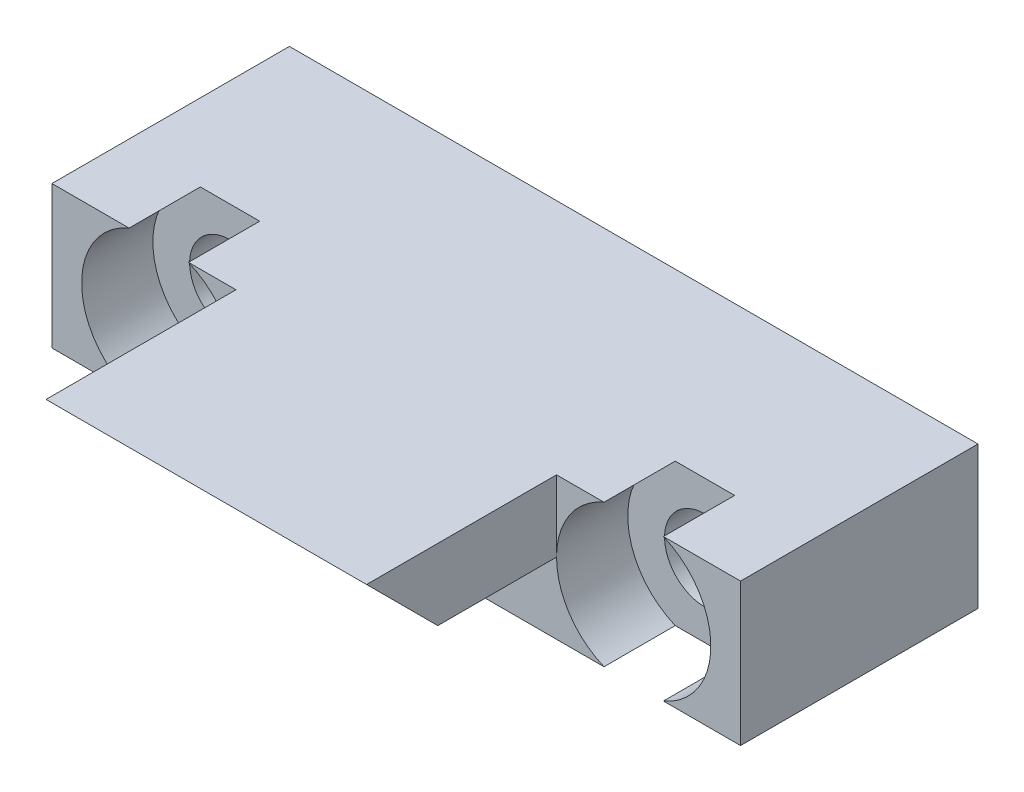
ISO-10303-21;
HEADER;
FILE_DESCRIPTION(('STEP AP214'),'2;1');
FILE_NAME('part.step','',(''),(''),'','','');
FILE_SCHEMA(('AUTOMOTIVE_DESIGN { 1 0 10303 214 1 1 1 1 }'));
ENDSEC;
DATA;
#1=APPLICATION_CONTEXT('core data for automotive mechanical design processes');
#2=APPLICATION_PROTOCOL_DEFINITION('international standard','automotive_design',2000,#1);
#3=PRODUCT_CONTEXT('',#1,'mechanical');
#4=PRODUCT('Part','Part','',(#3));
#5=PRODUCT_RELATED_PRODUCT_CATEGORY('part','',(#4));
#6=PRODUCT_DEFINITION_FORMATION('','',#4);
#7=PRODUCT_DEFINITION_CONTEXT('part definition',#1,'design');
#8=PRODUCT_DEFINITION('design','',#6,#7);
#9=PRODUCT_DEFINITION_SHAPE('','',#8);
#10=(LENGTH_UNIT() NAMED_UNIT(*) SI_UNIT(.MILLI.,.METRE.));
#11=(NAMED_UNIT(*) PLANE_ANGLE_UNIT() SI_UNIT($,.RADIAN.));
#12=(NAMED_UNIT(*) SI_UNIT($,.STERADIAN.) SOLID_ANGLE_UNIT());
#13=UNCERTAINTY_MEASURE_WITH_UNIT(LENGTH_MEASURE(1.E-05),#10,'distance_accuracy_value','');
#14=(GEOMETRIC_REPRESENTATION_CONTEXT(3) GLOBAL_UNCERTAINTY_ASSIGNED_CONTEXT((#13)) GLOBAL_UNIT_ASSIGNED_CONTEXT((#10,
#11,#12)) REPRESENTATION_CONTEXT('',''));
#15=CARTESIAN_POINT('',(0.,0.,0.));
#16=DIRECTION('',(0.,0.,1.));
#17=DIRECTION('',(1.,0.,0.));
#18=AXIS2_PLACEMENT_3D('',#15,#16,#17);
#19=CARTESIAN_POINT('',(0.,0.,10.));
#20=DIRECTION('',(0.,0.,-1.));
#21=DIRECTION('',(-1.,0.,0.));
#22=AXIS2_PLACEMENT_3D('',#19,#20,#21);
#23=PLANE('',#22);
#24=DIRECTION('',(-1.,0.,0.));
#25=VECTOR('',#24,1.);
#26=CARTESIAN_POINT('',(-14.5,3.,10.));
#27=LINE('',#26,#25);
#28=CARTESIAN_POINT('',(-6.75,3.,10.));
#29=VERTEX_POINT('',#28);
#30=CARTESIAN_POINT('',(-8.75,3.,10.));
#31=VERTEX_POINT('',#30);
#32=EDGE_CURVE('E244',#29,#31,#27,.T.);
#33=ORIENTED_EDGE('',*,*,#32,.T.);
#34=CARTESIAN_POINT('',(-10.,0.,10.));
#35=DIRECTION('',(0.,0.,1.));
#36=DIRECTION('',(1.,0.,0.));
#37=AXIS2_PLACEMENT_3D('',#34,#35,#36);
#38=CIRCLE('',#37,3.25);
#39=CARTESIAN_POINT('',(-6.75,0.,10.));
#40=VERTEX_POINT('',#39);
#41=EDGE_CURVE('E161',#40,#31,#38,.T.);
#42=ORIENTED_EDGE('',*,*,#41,.F.);
#43=DIRECTION('',(0.,-1.,0.));
#44=VECTOR('',#43,1.);
#45=CARTESIAN_POINT('',(-6.75,3.,10.));
#46=LINE('',#45,#44);
#47=EDGE_CURVE('E270',#29,#40,#46,.T.);
#48=ORIENTED_EDGE('',*,*,#47,.F.);
#49=EDGE_LOOP('',(#33,#42,#48));
#50=FACE_BOUND('',#49,.T.);
#51=ADVANCED_FACE('F41',(#50),#23,.F.);
#52=DIRECTION('',(1.,0.,0.));
#53=VECTOR('',#52,1.);
#54=CARTESIAN_POINT('',(-6.75,0.,10.));
#55=LINE('',#54,#53);
#56=CARTESIAN_POINT('',(6.75,0.,10.));
#57=VERTEX_POINT('',#56);
#58=EDGE_CURVE('E266',#40,#57,#55,.T.);
#59=ORIENTED_EDGE('',*,*,#58,.F.);
#60=CARTESIAN_POINT('',(-8.75,-3.,10.));
#61=VERTEX_POINT('',#60);
#62=EDGE_CURVE('E330',#61,#40,#38,.T.);
#63=ORIENTED_EDGE('',*,*,#62,.F.);
#64=DIRECTION('',(1.,0.,0.));
#65=VECTOR('',#64,1.);
#66=CARTESIAN_POINT('',(-14.5,-3.,10.));
#67=LINE('',#66,#65);
#68=CARTESIAN_POINT('',(8.75000000000001,-3.,10.));
#69=VERTEX_POINT('',#68);
#70=EDGE_CURVE('E233',#61,#69,#67,.T.);
#71=ORIENTED_EDGE('',*,*,#70,.T.);
#72=CARTESIAN_POINT('',(10.,0.,10.));
#73=DIRECTION('',(0.,0.,1.));
#74=DIRECTION('',(1.,0.,0.));
#75=AXIS2_PLACEMENT_3D('',#72,#73,#74);
#76=CIRCLE('',#75,3.25);
#77=EDGE_CURVE('E310',#57,#69,#76,.T.);
#78=ORIENTED_EDGE('',*,*,#77,.F.);
#79=EDGE_LOOP('',(#59,#63,#71,#78));
#80=FACE_BOUND('',#79,.T.);
#81=ADVANCED_FACE('F339',(#80),#23,.F.);
#82=CARTESIAN_POINT('',(14.5,3.,10.));
#83=VERTEX_POINT('',#82);
#84=CARTESIAN_POINT('',(11.25,3.,10.));
#85=VERTEX_POINT('',#84);
#86=EDGE_CURVE('E238',#83,#85,#27,.T.);
#87=ORIENTED_EDGE('',*,*,#86,.T.);
#88=CARTESIAN_POINT('',(11.25,-3.,10.));
#89=VERTEX_POINT('',#88);
#90=EDGE_CURVE('E307',#89,#85,#76,.T.);
#91=ORIENTED_EDGE('',*,*,#90,.F.);
#92=CARTESIAN_POINT('',(14.5,-3.,10.));
#93=VERTEX_POINT('',#92);
#94=EDGE_CURVE('E234',#89,#93,#67,.T.);
#95=ORIENTED_EDGE('',*,*,#94,.T.);
#96=DIRECTION('',(0.,1.,0.));
#97=VECTOR('',#96,1.);
#98=CARTESIAN_POINT('',(14.5,-3.,10.));
#99=LINE('',#98,#97);
#100=EDGE_CURVE('E218',#93,#83,#99,.T.);
#101=ORIENTED_EDGE('',*,*,#100,.T.);
#102=EDGE_LOOP('',(#87,#91,#95,#101));
#103=FACE_BOUND('',#102,.T.);
#104=ADVANCED_FACE('F387',(#103),#23,.F.);
#105=DIRECTION('',(0.,1.,0.));
#106=VECTOR('',#105,1.);
#107=CARTESIAN_POINT('',(6.75,3.,10.));
#108=LINE('',#107,#106);
#109=CARTESIAN_POINT('',(6.74999999999999,3.,10.));
#110=VERTEX_POINT('',#109);
#111=EDGE_CURVE('E262',#57,#110,#108,.T.);
#112=ORIENTED_EDGE('',*,*,#111,.F.);
#113=CARTESIAN_POINT('',(8.74999999999999,3.,10.));
#114=VERTEX_POINT('',#113);
#115=EDGE_CURVE('E306',#114,#57,#76,.T.);
#116=ORIENTED_EDGE('',*,*,#115,.F.);
#117=EDGE_CURVE('E242',#114,#110,#27,.T.);
#118=ORIENTED_EDGE('',*,*,#117,.T.);
#119=EDGE_LOOP('',(#112,#116,#118));
#120=FACE_BOUND('',#119,.T.);
#121=ADVANCED_FACE('F412',(#120),#23,.F.);
#122=CARTESIAN_POINT('',(-14.5,-3.,10.));
#123=VERTEX_POINT('',#122);
#124=CARTESIAN_POINT('',(-11.25,-3.,10.));
#125=VERTEX_POINT('',#124);
#126=EDGE_CURVE('E214',#123,#125,#67,.T.);
#127=ORIENTED_EDGE('',*,*,#126,.T.);
#128=CARTESIAN_POINT('',(-11.25,3.,10.));
#129=VERTEX_POINT('',#128);
#130=EDGE_CURVE('E329',#129,#125,#38,.T.);
#131=ORIENTED_EDGE('',*,*,#130,.F.);
#132=CARTESIAN_POINT('',(-14.5,3.,10.));
#133=VERTEX_POINT('',#132);
#134=EDGE_CURVE('E243',#129,#133,#27,.T.);
#135=ORIENTED_EDGE('',*,*,#134,.T.);
#136=DIRECTION('',(0.,-1.,0.));
#137=VECTOR('',#136,1.);
#138=CARTESIAN_POINT('',(-14.5,-3.,10.));
#139=LINE('',#138,#137);
#140=EDGE_CURVE('E235',#133,#123,#139,.T.);
#141=ORIENTED_EDGE('',*,*,#140,.T.);
#142=EDGE_LOOP('',(#127,#131,#135,#141));
#143=FACE_BOUND('',#142,.T.);
#144=ADVANCED_FACE('F358',(#143),#23,.F.);
#145=CARTESIAN_POINT('',(14.5,-3.,10.));
#146=DIRECTION('',(-1.,0.,0.));
#147=DIRECTION('',(0.,0.,1.));
#148=AXIS2_PLACEMENT_3D('',#145,#146,#147);
#149=PLANE('',#148);
#150=DIRECTION('',(0.,1.,0.));
#151=VECTOR('',#150,1.);
#152=CARTESIAN_POINT('',(14.5,-3.,0.));
#153=LINE('',#152,#151);
#154=CARTESIAN_POINT('',(14.5,-3.,0.));
#155=VERTEX_POINT('',#154);
#156=CARTESIAN_POINT('',(14.5,3.,0.));
#157=VERTEX_POINT('',#156);
#158=EDGE_CURVE('E225',#155,#157,#153,.T.);
#159=ORIENTED_EDGE('',*,*,#158,.T.);
#160=DIRECTION('',(0.,0.,-1.));
#161=VECTOR('',#160,1.);
#162=CARTESIAN_POINT('',(14.5,3.,10.));
#163=LINE('',#162,#161);
#164=EDGE_CURVE('E198',#83,#157,#163,.T.);
#165=ORIENTED_EDGE('',*,*,#164,.F.);
#166=ORIENTED_EDGE('',*,*,#100,.F.);
#167=DIRECTION('',(0.,0.,-1.));
#168=VECTOR('',#167,1.);
#169=CARTESIAN_POINT('',(14.5,-3.,10.));
#170=LINE('',#169,#168);
#171=EDGE_CURVE('E210',#93,#155,#170,.T.);
#172=ORIENTED_EDGE('',*,*,#171,.T.);
#173=EDGE_LOOP('',(#159,#165,#166,#172));
#174=FACE_BOUND('',#173,.T.);
#175=ADVANCED_FACE('F392',(#174),#149,.F.);
#176=CARTESIAN_POINT('',(-14.5,3.,10.));
#177=DIRECTION('',(0.,-1.,0.));
#178=DIRECTION('',(0.,0.,-1.));
#179=AXIS2_PLACEMENT_3D('',#176,#177,#178);
#180=PLANE('',#179);
#181=DIRECTION('',(1.,0.,0.));
#182=VECTOR('',#181,1.);
#183=CARTESIAN_POINT('',(-14.5,3.,7.));
#184=LINE('',#183,#182);
#185=CARTESIAN_POINT('',(-11.25,3.,7.));
#186=VERTEX_POINT('',#185);
#187=CARTESIAN_POINT('',(-8.75,3.,7.));
#188=VERTEX_POINT('',#187);
#189=EDGE_CURVE('E167',#186,#188,#184,.T.);
#190=ORIENTED_EDGE('',*,*,#189,.T.);
#191=DIRECTION('',(0.,0.,1.));
#192=VECTOR('',#191,1.);
#193=CARTESIAN_POINT('',(-8.75,3.,10.));
#194=LINE('',#193,#192);
#195=EDGE_CURVE('E154',#188,#31,#194,.T.);
#196=ORIENTED_EDGE('',*,*,#195,.T.);
#197=ORIENTED_EDGE('',*,*,#32,.F.);
#198=DIRECTION('',(0.,0.,-1.));
#199=VECTOR('',#198,1.);
#200=CARTESIAN_POINT('',(-6.75,3.,18.));
#201=LINE('',#200,#199);
#202=CARTESIAN_POINT('',(-6.75,3.,18.));
#203=VERTEX_POINT('',#202);
#204=EDGE_CURVE('E257',#203,#29,#201,.T.);
#205=ORIENTED_EDGE('',*,*,#204,.F.);
#206=DIRECTION('',(-1.,0.,0.));
#207=VECTOR('',#206,1.);
#208=CARTESIAN_POINT('',(-6.75,3.,18.));
#209=LINE('',#208,#207);
#210=CARTESIAN_POINT('',(6.75,3.,18.));
#211=VERTEX_POINT('',#210);
#212=EDGE_CURVE('E261',#211,#203,#209,.T.);
#213=ORIENTED_EDGE('',*,*,#212,.F.);
#214=DIRECTION('',(0.,0.,-1.));
#215=VECTOR('',#214,1.);
#216=CARTESIAN_POINT('',(6.75,3.,18.));
#217=LINE('',#216,#215);
#218=EDGE_CURVE('E253',#211,#110,#217,.T.);
#219=ORIENTED_EDGE('',*,*,#218,.T.);
#220=ORIENTED_EDGE('',*,*,#117,.F.);
#221=DIRECTION('',(0.,0.,1.));
#222=VECTOR('',#221,1.);
#223=CARTESIAN_POINT('',(8.74999999999999,3.,10.));
#224=LINE('',#223,#222);
#225=CARTESIAN_POINT('',(8.74999999999999,3.,7.));
#226=VERTEX_POINT('',#225);
#227=EDGE_CURVE('E289',#114,#226,#224,.F.);
#228=ORIENTED_EDGE('',*,*,#227,.T.);
#229=DIRECTION('',(1.,0.,0.));
#230=VECTOR('',#229,1.);
#231=CARTESIAN_POINT('',(-14.5,3.,7.));
#232=LINE('',#231,#230);
#233=CARTESIAN_POINT('',(11.25,3.,7.));
#234=VERTEX_POINT('',#233);
#235=EDGE_CURVE('E194',#226,#234,#232,.T.);
#236=ORIENTED_EDGE('',*,*,#235,.T.);
#237=DIRECTION('',(0.,0.,1.));
#238=VECTOR('',#237,1.);
#239=CARTESIAN_POINT('',(11.25,3.,10.));
#240=LINE('',#239,#238);
#241=EDGE_CURVE('E281',#234,#85,#240,.T.);
#242=ORIENTED_EDGE('',*,*,#241,.T.);
#243=ORIENTED_EDGE('',*,*,#86,.F.);
#244=ORIENTED_EDGE('',*,*,#164,.T.);
#245=DIRECTION('',(-1.,0.,0.));
#246=VECTOR('',#245,1.);
#247=CARTESIAN_POINT('',(-14.5,3.,0.));
#248=LINE('',#247,#246);
#249=CARTESIAN_POINT('',(-14.5,3.,0.));
#250=VERTEX_POINT('',#249);
#251=EDGE_CURVE('E222',#157,#250,#248,.T.);
#252=ORIENTED_EDGE('',*,*,#251,.T.);
#253=DIRECTION('',(0.,0.,-1.));
#254=VECTOR('',#253,1.);
#255=CARTESIAN_POINT('',(-14.5,3.,10.));
#256=LINE('',#255,#254);
#257=EDGE_CURVE('E202',#133,#250,#256,.T.);
#258=ORIENTED_EDGE('',*,*,#257,.F.);
#259=ORIENTED_EDGE('',*,*,#134,.F.);
#260=DIRECTION('',(0.,0.,1.));
#261=VECTOR('',#260,1.);
#262=CARTESIAN_POINT('',(-11.25,3.,10.));
#263=LINE('',#262,#261);
#264=EDGE_CURVE('E181',#129,#186,#263,.F.);
#265=ORIENTED_EDGE('',*,*,#264,.T.);
#266=EDGE_LOOP('',(#190,#196,#197,#205,#213,#219,#220,#228,#236,#242,#243,#244,#252,#258,#259,#265));
#267=FACE_BOUND('',#266,.T.);
#268=ADVANCED_FACE('F179',(#267),#180,.F.);
#269=CARTESIAN_POINT('',(-14.5,-3.,10.));
#270=DIRECTION('',(1.,0.,0.));
#271=DIRECTION('',(0.,0.,-1.));
#272=AXIS2_PLACEMENT_3D('',#269,#270,#271);
#273=PLANE('',#272);
#274=DIRECTION('',(0.,-1.,0.));
#275=VECTOR('',#274,1.);
#276=CARTESIAN_POINT('',(-14.5,-3.,0.));
#277=LINE('',#276,#275);
#278=CARTESIAN_POINT('',(-14.5,-3.,0.));
#279=VERTEX_POINT('',#278);
#280=EDGE_CURVE('E219',#250,#279,#277,.T.);
#281=ORIENTED_EDGE('',*,*,#280,.T.);
#282=DIRECTION('',(0.,0.,-1.));
#283=VECTOR('',#282,1.);
#284=CARTESIAN_POINT('',(-14.5,-3.,10.));
#285=LINE('',#284,#283);
#286=EDGE_CURVE('E206',#123,#279,#285,.T.);
#287=ORIENTED_EDGE('',*,*,#286,.F.);
#288=ORIENTED_EDGE('',*,*,#140,.F.);
#289=ORIENTED_EDGE('',*,*,#257,.T.);
#290=EDGE_LOOP('',(#281,#287,#288,#289));
#291=FACE_BOUND('',#290,.T.);
#292=ADVANCED_FACE('F363',(#291),#273,.F.);
#293=CARTESIAN_POINT('',(-14.5,-3.,10.));
#294=DIRECTION('',(0.,1.,0.));
#295=DIRECTION('',(0.,0.,1.));
#296=AXIS2_PLACEMENT_3D('',#293,#294,#295);
#297=PLANE('',#296);
#298=DIRECTION('',(-1.,0.,0.));
#299=VECTOR('',#298,1.);
#300=CARTESIAN_POINT('',(-14.5,-3.,7.));
#301=LINE('',#300,#299);
#302=CARTESIAN_POINT('',(-8.75,-3.,7.));
#303=VERTEX_POINT('',#302);
#304=CARTESIAN_POINT('',(-11.25,-3.,7.));
#305=VERTEX_POINT('',#304);
#306=EDGE_CURVE('E175',#303,#305,#301,.T.);
#307=ORIENTED_EDGE('',*,*,#306,.T.);
#308=DIRECTION('',(0.,0.,1.));
#309=VECTOR('',#308,1.);
#310=CARTESIAN_POINT('',(-11.25,-3.,10.));
#311=LINE('',#310,#309);
#312=EDGE_CURVE('E313',#305,#125,#311,.T.);
#313=ORIENTED_EDGE('',*,*,#312,.T.);
#314=ORIENTED_EDGE('',*,*,#126,.F.);
#315=ORIENTED_EDGE('',*,*,#286,.T.);
#316=DIRECTION('',(1.,0.,0.));
#317=VECTOR('',#316,1.);
#318=CARTESIAN_POINT('',(-14.5,-3.,0.));
#319=LINE('',#318,#317);
#320=EDGE_CURVE('E215',#279,#155,#319,.T.);
#321=ORIENTED_EDGE('',*,*,#320,.T.);
#322=ORIENTED_EDGE('',*,*,#171,.F.);
#323=ORIENTED_EDGE('',*,*,#94,.F.);
#324=DIRECTION('',(0.,0.,1.));
#325=VECTOR('',#324,1.);
#326=CARTESIAN_POINT('',(11.25,-3.,10.));
#327=LINE('',#326,#325);
#328=CARTESIAN_POINT('',(11.25,-3.,7.));
#329=VERTEX_POINT('',#328);
#330=EDGE_CURVE('E285',#89,#329,#327,.F.);
#331=ORIENTED_EDGE('',*,*,#330,.T.);
#332=DIRECTION('',(-1.,0.,0.));
#333=VECTOR('',#332,1.);
#334=CARTESIAN_POINT('',(-14.5,-3.,7.));
#335=LINE('',#334,#333);
#336=CARTESIAN_POINT('',(8.75000000000001,-3.,7.));
#337=VERTEX_POINT('',#336);
#338=EDGE_CURVE('E185',#329,#337,#335,.T.);
#339=ORIENTED_EDGE('',*,*,#338,.T.);
#340=DIRECTION('',(0.,0.,1.));
#341=VECTOR('',#340,1.);
#342=CARTESIAN_POINT('',(8.75000000000001,-3.,10.));
#343=LINE('',#342,#341);
#344=EDGE_CURVE('E274',#337,#69,#343,.T.);
#345=ORIENTED_EDGE('',*,*,#344,.T.);
#346=ORIENTED_EDGE('',*,*,#70,.F.);
#347=DIRECTION('',(0.,0.,1.));
#348=VECTOR('',#347,1.);
#349=CARTESIAN_POINT('',(-8.75,-3.,10.));
#350=LINE('',#349,#348);
#351=EDGE_CURVE('E317',#61,#303,#350,.F.);
#352=ORIENTED_EDGE('',*,*,#351,.T.);
#353=EDGE_LOOP('',(#307,#313,#314,#315,#321,#322,#323,#331,#339,#345,#346,#352));
#354=FACE_BOUND('',#353,.T.);
#355=ADVANCED_FACE('F367',(#354),#297,.F.);
#356=CARTESIAN_POINT('',(0.,0.,0.));
#357=DIRECTION('',(0.,0.,-1.));
#358=DIRECTION('',(-1.,0.,0.));
#359=AXIS2_PLACEMENT_3D('',#356,#357,#358);
#360=PLANE('',#359);
#361=CARTESIAN_POINT('',(-10.,0.,0.));
#362=DIRECTION('',(0.,0.,1.));
#363=DIRECTION('',(1.,0.,0.));
#364=AXIS2_PLACEMENT_3D('',#361,#362,#363);
#365=CIRCLE('',#364,1.7);
#366=CARTESIAN_POINT('',(-8.3,0.,0.));
#367=VERTEX_POINT('',#366);
#368=EDGE_CURVE('E320',#367,#367,#365,.T.);
#369=ORIENTED_EDGE('',*,*,#368,.T.);
#370=EDGE_LOOP('',(#369));
#371=FACE_BOUND('',#370,.T.);
#372=CARTESIAN_POINT('',(10.,0.,0.));
#373=DIRECTION('',(0.,0.,1.));
#374=DIRECTION('',(1.,0.,0.));
#375=AXIS2_PLACEMENT_3D('',#372,#373,#374);
#376=CIRCLE('',#375,1.7);
#377=CARTESIAN_POINT('',(11.7,0.,0.));
#378=VERTEX_POINT('',#377);
#379=EDGE_CURVE('E293',#378,#378,#376,.T.);
#380=ORIENTED_EDGE('',*,*,#379,.T.);
#381=EDGE_LOOP('',(#380));
#382=FACE_BOUND('',#381,.T.);
#383=ORIENTED_EDGE('',*,*,#158,.F.);
#384=ORIENTED_EDGE('',*,*,#320,.F.);
#385=ORIENTED_EDGE('',*,*,#280,.F.);
#386=ORIENTED_EDGE('',*,*,#251,.F.);
#387=EDGE_LOOP('',(#383,#384,#385,#386));
#388=FACE_BOUND('',#387,.T.);
#389=ADVANCED_FACE('F394',(#371,#382,#388),#360,.T.);
#390=CARTESIAN_POINT('',(-6.75,3.,18.));
#391=DIRECTION('',(1.,0.,0.));
#392=DIRECTION('',(0.,1.,0.));
#393=AXIS2_PLACEMENT_3D('',#390,#391,#392);
#394=PLANE('',#393);
#395=DIRECTION('',(0.,0.,-1.));
#396=VECTOR('',#395,1.);
#397=CARTESIAN_POINT('',(-6.75,0.,18.));
#398=LINE('',#397,#396);
#399=CARTESIAN_POINT('',(-6.75,0.,15.));
#400=VERTEX_POINT('',#399);
#401=EDGE_CURVE('E229',#400,#40,#398,.T.);
#402=ORIENTED_EDGE('',*,*,#401,.F.);
#403=DIRECTION('',(0.,0.707106781186546,0.707106781186549));
#404=VECTOR('',#403,1.);
#405=CARTESIAN_POINT('',(-6.75,3.,18.));
#406=LINE('',#405,#404);
#407=EDGE_CURVE('E11',#400,#203,#406,.T.);
#408=ORIENTED_EDGE('',*,*,#407,.T.);
#409=ORIENTED_EDGE('',*,*,#204,.T.);
#410=ORIENTED_EDGE('',*,*,#47,.T.);
#411=EDGE_LOOP('',(#402,#408,#409,#410));
#412=FACE_BOUND('',#411,.T.);
#413=ADVANCED_FACE('F343',(#412),#394,.F.);
#414=CARTESIAN_POINT('',(-6.75,0.,18.));
#415=DIRECTION('',(0.,1.,0.));
#416=DIRECTION('',(-1.,0.,0.));
#417=AXIS2_PLACEMENT_3D('',#414,#415,#416);
#418=PLANE('',#417);
#419=DIRECTION('',(0.,0.,-1.));
#420=VECTOR('',#419,1.);
#421=CARTESIAN_POINT('',(6.75,0.,18.));
#422=LINE('',#421,#420);
#423=CARTESIAN_POINT('',(6.75,0.,15.));
#424=VERTEX_POINT('',#423);
#425=EDGE_CURVE('E250',#424,#57,#422,.T.);
#426=ORIENTED_EDGE('',*,*,#425,.F.);
#427=DIRECTION('',(-1.,0.,0.));
#428=VECTOR('',#427,1.);
#429=CARTESIAN_POINT('',(-6.75,0.,15.));
#430=LINE('',#429,#428);
#431=EDGE_CURVE('E51',#424,#400,#430,.T.);
#432=ORIENTED_EDGE('',*,*,#431,.T.);
#433=ORIENTED_EDGE('',*,*,#401,.T.);
#434=ORIENTED_EDGE('',*,*,#58,.T.);
#435=EDGE_LOOP('',(#426,#432,#433,#434));
#436=FACE_BOUND('',#435,.T.);
#437=ADVANCED_FACE('F402',(#436),#418,.F.);
#438=CARTESIAN_POINT('',(6.75,3.,18.));
#439=DIRECTION('',(-1.,0.,0.));
#440=DIRECTION('',(0.,0.,1.));
#441=AXIS2_PLACEMENT_3D('',#438,#439,#440);
#442=PLANE('',#441);
#443=ORIENTED_EDGE('',*,*,#218,.F.);
#444=DIRECTION('',(0.,-0.707106781186546,-0.707106781186549));
#445=VECTOR('',#444,1.);
#446=CARTESIAN_POINT('',(6.75,3.,18.));
#447=LINE('',#446,#445);
#448=EDGE_CURVE('E65',#211,#424,#447,.T.);
#449=ORIENTED_EDGE('',*,*,#448,.T.);
#450=ORIENTED_EDGE('',*,*,#425,.T.);
#451=ORIENTED_EDGE('',*,*,#111,.T.);
#452=EDGE_LOOP('',(#443,#449,#450,#451));
#453=FACE_BOUND('',#452,.T.);
#454=ADVANCED_FACE('F348',(#453),#442,.F.);
#455=CARTESIAN_POINT('',(11.7,0.,7.));
#456=DIRECTION('',(0.,0.,-1.));
#457=DIRECTION('',(-1.,0.,0.));
#458=AXIS2_PLACEMENT_3D('',#455,#456,#457);
#459=PLANE('',#458);
#460=CARTESIAN_POINT('',(10.,0.,7.));
#461=DIRECTION('',(0.,0.,1.));
#462=DIRECTION('',(1.,0.,0.));
#463=AXIS2_PLACEMENT_3D('',#460,#461,#462);
#464=CIRCLE('',#463,1.7);
#465=CARTESIAN_POINT('',(11.7,0.,7.));
#466=VERTEX_POINT('',#465);
#467=EDGE_CURVE('E297',#466,#466,#464,.T.);
#468=ORIENTED_EDGE('',*,*,#467,.F.);
#469=EDGE_LOOP('',(#468));
#470=FACE_BOUND('',#469,.T.);
#471=CARTESIAN_POINT('',(10.,0.,7.));
#472=DIRECTION('',(0.,0.,1.));
#473=DIRECTION('',(1.,0.,0.));
#474=AXIS2_PLACEMENT_3D('',#471,#472,#473);
#475=CIRCLE('',#474,3.25);
#476=EDGE_CURVE('E302',#329,#234,#475,.T.);
#477=ORIENTED_EDGE('',*,*,#476,.T.);
#478=ORIENTED_EDGE('',*,*,#235,.F.);
#479=EDGE_CURVE('E301',#226,#337,#475,.T.);
#480=ORIENTED_EDGE('',*,*,#479,.T.);
#481=ORIENTED_EDGE('',*,*,#338,.F.);
#482=EDGE_LOOP('',(#477,#478,#480,#481));
#483=FACE_BOUND('',#482,.T.);
#484=ADVANCED_FACE('F378',(#470,#483),#459,.F.);
#485=CARTESIAN_POINT('',(10.,0.,10.));
#486=DIRECTION('',(0.,0.,1.));
#487=DIRECTION('',(1.,0.,0.));
#488=AXIS2_PLACEMENT_3D('',#485,#486,#487);
#489=CYLINDRICAL_SURFACE('',#488,3.25);
#490=ORIENTED_EDGE('',*,*,#479,.F.);
#491=ORIENTED_EDGE('',*,*,#227,.F.);
#492=ORIENTED_EDGE('',*,*,#115,.T.);
#493=ORIENTED_EDGE('',*,*,#77,.T.);
#494=ORIENTED_EDGE('',*,*,#344,.F.);
#495=EDGE_LOOP('',(#490,#491,#492,#493,#494));
#496=FACE_BOUND('',#495,.T.);
#497=ADVANCED_FACE('F420',(#496),#489,.F.);
#498=ORIENTED_EDGE('',*,*,#476,.F.);
#499=ORIENTED_EDGE('',*,*,#330,.F.);
#500=ORIENTED_EDGE('',*,*,#90,.T.);
#501=ORIENTED_EDGE('',*,*,#241,.F.);
#502=EDGE_LOOP('',(#498,#499,#500,#501));
#503=FACE_BOUND('',#502,.T.);
#504=ADVANCED_FACE('F385',(#503),#489,.F.);
#505=CARTESIAN_POINT('',(10.,0.,10.));
#506=DIRECTION('',(0.,0.,1.));
#507=DIRECTION('',(1.,0.,0.));
#508=AXIS2_PLACEMENT_3D('',#505,#506,#507);
#509=CYLINDRICAL_SURFACE('',#508,1.7);
#510=ORIENTED_EDGE('',*,*,#379,.F.);
#511=EDGE_LOOP('',(#510));
#512=FACE_BOUND('',#511,.T.);
#513=ORIENTED_EDGE('',*,*,#467,.T.);
#514=EDGE_LOOP('',(#513));
#515=FACE_BOUND('',#514,.T.);
#516=ADVANCED_FACE('F427',(#512,#515),#509,.F.);
#517=CARTESIAN_POINT('',(-8.3,0.,7.));
#518=DIRECTION('',(0.,0.,-1.));
#519=DIRECTION('',(-1.,0.,0.));
#520=AXIS2_PLACEMENT_3D('',#517,#518,#519);
#521=PLANE('',#520);
#522=CARTESIAN_POINT('',(-10.,0.,7.));
#523=DIRECTION('',(0.,0.,1.));
#524=DIRECTION('',(1.,0.,0.));
#525=AXIS2_PLACEMENT_3D('',#522,#523,#524);
#526=CIRCLE('',#525,1.7);
#527=CARTESIAN_POINT('',(-8.3,0.,7.));
#528=VERTEX_POINT('',#527);
#529=EDGE_CURVE('E324',#528,#528,#526,.T.);
#530=ORIENTED_EDGE('',*,*,#529,.F.);
#531=EDGE_LOOP('',(#530));
#532=FACE_BOUND('',#531,.T.);
#533=CARTESIAN_POINT('',(-10.,0.,7.));
#534=DIRECTION('',(0.,0.,1.));
#535=DIRECTION('',(1.,0.,0.));
#536=AXIS2_PLACEMENT_3D('',#533,#534,#535);
#537=CIRCLE('',#536,3.25);
#538=EDGE_CURVE('E158',#303,#188,#537,.T.);
#539=ORIENTED_EDGE('',*,*,#538,.T.);
#540=ORIENTED_EDGE('',*,*,#189,.F.);
#541=EDGE_CURVE('E177',#186,#305,#537,.T.);
#542=ORIENTED_EDGE('',*,*,#541,.T.);
#543=ORIENTED_EDGE('',*,*,#306,.F.);
#544=EDGE_LOOP('',(#539,#540,#542,#543));
#545=FACE_BOUND('',#544,.T.);
#546=ADVANCED_FACE('F171',(#532,#545),#521,.F.);
#547=CARTESIAN_POINT('',(-10.,0.,10.));
#548=DIRECTION('',(0.,0.,1.));
#549=DIRECTION('',(1.,0.,0.));
#550=AXIS2_PLACEMENT_3D('',#547,#548,#549);
#551=CYLINDRICAL_SURFACE('',#550,3.25);
#552=ORIENTED_EDGE('',*,*,#541,.F.);
#553=ORIENTED_EDGE('',*,*,#264,.F.);
#554=ORIENTED_EDGE('',*,*,#130,.T.);
#555=ORIENTED_EDGE('',*,*,#312,.F.);
#556=EDGE_LOOP('',(#552,#553,#554,#555));
#557=FACE_BOUND('',#556,.T.);
#558=ADVANCED_FACE('F369',(#557),#551,.F.);
#559=ORIENTED_EDGE('',*,*,#62,.T.);
#560=ORIENTED_EDGE('',*,*,#41,.T.);
#561=ORIENTED_EDGE('',*,*,#195,.F.);
#562=ORIENTED_EDGE('',*,*,#538,.F.);
#563=ORIENTED_EDGE('',*,*,#351,.F.);
#564=EDGE_LOOP('',(#559,#560,#561,#562,#563));
#565=FACE_BOUND('',#564,.T.);
#566=ADVANCED_FACE('F157',(#565),#551,.F.);
#567=CARTESIAN_POINT('',(-10.,0.,10.));
#568=DIRECTION('',(0.,0.,1.));
#569=DIRECTION('',(1.,0.,0.));
#570=AXIS2_PLACEMENT_3D('',#567,#568,#569);
#571=CYLINDRICAL_SURFACE('',#570,1.7);
#572=ORIENTED_EDGE('',*,*,#368,.F.);
#573=EDGE_LOOP('',(#572));
#574=FACE_BOUND('',#573,.T.);
#575=ORIENTED_EDGE('',*,*,#529,.T.);
#576=EDGE_LOOP('',(#575));
#577=FACE_BOUND('',#576,.T.);
#578=ADVANCED_FACE('F431',(#574,#577),#571,.F.);
#579=CARTESIAN_POINT('',(0.,3.,18.));
#580=DIRECTION('',(0.,-0.707106781186549,0.707106781186546));
#581=DIRECTION('',(-1.,0.,0.));
#582=AXIS2_PLACEMENT_3D('',#579,#580,#581);
#583=PLANE('',#582);
#584=ORIENTED_EDGE('',*,*,#407,.F.);
#585=ORIENTED_EDGE('',*,*,#431,.F.);
#586=ORIENTED_EDGE('',*,*,#448,.F.);
#587=ORIENTED_EDGE('',*,*,#212,.T.);
#588=EDGE_LOOP('',(#584,#585,#586,#587));
#589=FACE_BOUND('',#588,.T.);
#590=ADVANCED_FACE('F44',(#589),#583,.T.);
#591=CLOSED_SHELL('',(#51,#81,#104,#121,#144,#175,#268,#292,#355,#389,#413,#437,#454,#484,#497,
#504,#516,#546,#558,#566,#578,#590));
#592=MANIFOLD_SOLID_BREP('B2',#591);
#593=ADVANCED_BREP_SHAPE_REPRESENTATION('',(#18,#592),#14);
#594=SHAPE_DEFINITION_REPRESENTATION(#9,#593);
ENDSEC;
END-ISO-10303-21;
